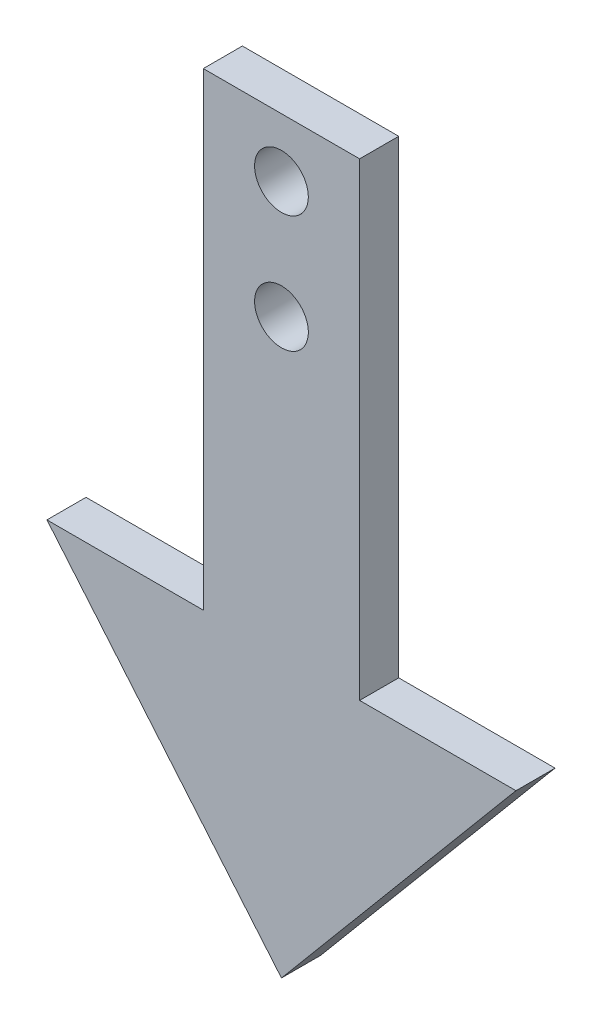
ISO-10303-21;
HEADER;
FILE_DESCRIPTION(('STEP AP214'),'2;1');
FILE_NAME('part.step','',(''),(''),'','','');
FILE_SCHEMA(('AUTOMOTIVE_DESIGN { 1 0 10303 214 1 1 1 1 }'));
ENDSEC;
DATA;
#1=APPLICATION_CONTEXT('core data for automotive mechanical design processes');
#2=APPLICATION_PROTOCOL_DEFINITION('international standard','automotive_design',2000,#1);
#3=PRODUCT_CONTEXT('',#1,'mechanical');
#4=PRODUCT('Part','Part','',(#3));
#5=PRODUCT_RELATED_PRODUCT_CATEGORY('part','',(#4));
#6=PRODUCT_DEFINITION_FORMATION('','',#4);
#7=PRODUCT_DEFINITION_CONTEXT('part definition',#1,'design');
#8=PRODUCT_DEFINITION('design','',#6,#7);
#9=PRODUCT_DEFINITION_SHAPE('','',#8);
#10=(LENGTH_UNIT() NAMED_UNIT(*) SI_UNIT(.MILLI.,.METRE.));
#11=(NAMED_UNIT(*) PLANE_ANGLE_UNIT() SI_UNIT($,.RADIAN.));
#12=(NAMED_UNIT(*) SI_UNIT($,.STERADIAN.) SOLID_ANGLE_UNIT());
#13=UNCERTAINTY_MEASURE_WITH_UNIT(LENGTH_MEASURE(1.E-05),#10,'distance_accuracy_value','');
#14=(GEOMETRIC_REPRESENTATION_CONTEXT(3) GLOBAL_UNCERTAINTY_ASSIGNED_CONTEXT((#13)) GLOBAL_UNIT_ASSIGNED_CONTEXT((#10,
#11,#12)) REPRESENTATION_CONTEXT('',''));
#15=CARTESIAN_POINT('',(0.,0.,0.));
#16=DIRECTION('',(0.,0.,1.));
#17=DIRECTION('',(1.,0.,0.));
#18=AXIS2_PLACEMENT_3D('',#15,#16,#17);
#19=CARTESIAN_POINT('',(6.35000000000002,-19.05,3.175));
#20=DIRECTION('',(0.,-1.,0.));
#21=DIRECTION('',(1.,0.,0.));
#22=AXIS2_PLACEMENT_3D('',#19,#20,#21);
#23=PLANE('',#22);
#24=DIRECTION('',(-1.,0.,0.));
#25=VECTOR('',#24,1.);
#26=CARTESIAN_POINT('',(6.35000000000002,-19.05,0.));
#27=LINE('',#26,#25);
#28=CARTESIAN_POINT('',(19.05,-19.05,0.));
#29=VERTEX_POINT('',#28);
#30=CARTESIAN_POINT('',(6.35000000000002,-19.05,0.));
#31=VERTEX_POINT('',#30);
#32=EDGE_CURVE('E125',#29,#31,#27,.T.);
#33=ORIENTED_EDGE('',*,*,#32,.T.);
#34=DIRECTION('',(0.,0.,-1.));
#35=VECTOR('',#34,1.);
#36=CARTESIAN_POINT('',(6.35000000000002,-19.05,3.175));
#37=LINE('',#36,#35);
#38=CARTESIAN_POINT('',(6.35000000000002,-19.05,3.175));
#39=VERTEX_POINT('',#38);
#40=EDGE_CURVE('E11',#39,#31,#37,.T.);
#41=ORIENTED_EDGE('',*,*,#40,.F.);
#42=DIRECTION('',(-1.,0.,0.));
#43=VECTOR('',#42,1.);
#44=CARTESIAN_POINT('',(6.35000000000002,-19.05,3.175));
#45=LINE('',#44,#43);
#46=CARTESIAN_POINT('',(19.05,-19.05,3.175));
#47=VERTEX_POINT('',#46);
#48=EDGE_CURVE('E138',#47,#39,#45,.T.);
#49=ORIENTED_EDGE('',*,*,#48,.F.);
#50=DIRECTION('',(0.,0.,-1.));
#51=VECTOR('',#50,1.);
#52=CARTESIAN_POINT('',(19.05,-19.05,3.175));
#53=LINE('',#52,#51);
#54=EDGE_CURVE('E121',#47,#29,#53,.T.);
#55=ORIENTED_EDGE('',*,*,#54,.T.);
#56=EDGE_LOOP('',(#33,#41,#49,#55));
#57=FACE_BOUND('',#56,.T.);
#58=ADVANCED_FACE('F35',(#57),#23,.F.);
#59=CARTESIAN_POINT('',(6.35,19.05,3.175));
#60=DIRECTION('',(-1.,0.,0.));
#61=DIRECTION('',(0.,-1.,0.));
#62=AXIS2_PLACEMENT_3D('',#59,#60,#61);
#63=PLANE('',#62);
#64=DIRECTION('',(0.,1.,0.));
#65=VECTOR('',#64,1.);
#66=CARTESIAN_POINT('',(6.35,19.05,0.));
#67=LINE('',#66,#65);
#68=CARTESIAN_POINT('',(6.35,19.05,0.));
#69=VERTEX_POINT('',#68);
#70=EDGE_CURVE('E128',#31,#69,#67,.T.);
#71=ORIENTED_EDGE('',*,*,#70,.T.);
#72=DIRECTION('',(0.,0.,-1.));
#73=VECTOR('',#72,1.);
#74=CARTESIAN_POINT('',(6.35,19.05,3.175));
#75=LINE('',#74,#73);
#76=CARTESIAN_POINT('',(6.35,19.05,3.175));
#77=VERTEX_POINT('',#76);
#78=EDGE_CURVE('E43',#77,#69,#75,.T.);
#79=ORIENTED_EDGE('',*,*,#78,.F.);
#80=DIRECTION('',(0.,1.,0.));
#81=VECTOR('',#80,1.);
#82=CARTESIAN_POINT('',(6.35,19.05,3.175));
#83=LINE('',#82,#81);
#84=EDGE_CURVE('E91',#39,#77,#83,.T.);
#85=ORIENTED_EDGE('',*,*,#84,.F.);
#86=ORIENTED_EDGE('',*,*,#40,.T.);
#87=EDGE_LOOP('',(#71,#79,#85,#86));
#88=FACE_BOUND('',#87,.T.);
#89=ADVANCED_FACE('F197',(#88),#63,.F.);
#90=CARTESIAN_POINT('',(-6.35,19.05,3.175));
#91=DIRECTION('',(0.,-1.,0.));
#92=DIRECTION('',(1.,0.,0.));
#93=AXIS2_PLACEMENT_3D('',#90,#91,#92);
#94=PLANE('',#93);
#95=DIRECTION('',(-1.,0.,0.));
#96=VECTOR('',#95,1.);
#97=CARTESIAN_POINT('',(-6.35,19.05,0.));
#98=LINE('',#97,#96);
#99=CARTESIAN_POINT('',(-6.35,19.05,0.));
#100=VERTEX_POINT('',#99);
#101=EDGE_CURVE('E131',#69,#100,#98,.T.);
#102=ORIENTED_EDGE('',*,*,#101,.T.);
#103=DIRECTION('',(0.,0.,-1.));
#104=VECTOR('',#103,1.);
#105=CARTESIAN_POINT('',(-6.35,19.05,3.175));
#106=LINE('',#105,#104);
#107=CARTESIAN_POINT('',(-6.35,19.05,3.175));
#108=VERTEX_POINT('',#107);
#109=EDGE_CURVE('E142',#108,#100,#106,.T.);
#110=ORIENTED_EDGE('',*,*,#109,.F.);
#111=DIRECTION('',(-1.,0.,0.));
#112=VECTOR('',#111,1.);
#113=CARTESIAN_POINT('',(-6.35,19.05,3.175));
#114=LINE('',#113,#112);
#115=EDGE_CURVE('E150',#77,#108,#114,.T.);
#116=ORIENTED_EDGE('',*,*,#115,.F.);
#117=ORIENTED_EDGE('',*,*,#78,.T.);
#118=EDGE_LOOP('',(#102,#110,#116,#117));
#119=FACE_BOUND('',#118,.T.);
#120=ADVANCED_FACE('F148',(#119),#94,.F.);
#121=CARTESIAN_POINT('',(-6.35,19.05,3.175));
#122=DIRECTION('',(1.,0.,0.));
#123=DIRECTION('',(0.,1.,0.));
#124=AXIS2_PLACEMENT_3D('',#121,#122,#123);
#125=PLANE('',#124);
#126=DIRECTION('',(0.,-1.,0.));
#127=VECTOR('',#126,1.);
#128=CARTESIAN_POINT('',(-6.35,19.05,0.));
#129=LINE('',#128,#127);
#130=CARTESIAN_POINT('',(-6.35000000000001,-19.05,0.));
#131=VERTEX_POINT('',#130);
#132=EDGE_CURVE('E133',#100,#131,#129,.T.);
#133=ORIENTED_EDGE('',*,*,#132,.T.);
#134=DIRECTION('',(0.,0.,-1.));
#135=VECTOR('',#134,1.);
#136=CARTESIAN_POINT('',(-6.35000000000001,-19.05,3.175));
#137=LINE('',#136,#135);
#138=CARTESIAN_POINT('',(-6.35000000000001,-19.05,3.175));
#139=VERTEX_POINT('',#138);
#140=EDGE_CURVE('E116',#139,#131,#137,.T.);
#141=ORIENTED_EDGE('',*,*,#140,.F.);
#142=DIRECTION('',(0.,-1.,0.));
#143=VECTOR('',#142,1.);
#144=CARTESIAN_POINT('',(-6.35,19.05,3.175));
#145=LINE('',#144,#143);
#146=EDGE_CURVE('E107',#108,#139,#145,.T.);
#147=ORIENTED_EDGE('',*,*,#146,.F.);
#148=ORIENTED_EDGE('',*,*,#109,.T.);
#149=EDGE_LOOP('',(#133,#141,#147,#148));
#150=FACE_BOUND('',#149,.T.);
#151=ADVANCED_FACE('F156',(#150),#125,.F.);
#152=CARTESIAN_POINT('',(-6.35000000000001,-19.05,3.175));
#153=DIRECTION('',(0.,-1.,0.));
#154=DIRECTION('',(1.,0.,0.));
#155=AXIS2_PLACEMENT_3D('',#152,#153,#154);
#156=PLANE('',#155);
#157=DIRECTION('',(-1.,0.,0.));
#158=VECTOR('',#157,1.);
#159=CARTESIAN_POINT('',(-6.35000000000001,-19.05,0.));
#160=LINE('',#159,#158);
#161=CARTESIAN_POINT('',(-19.05,-19.05,0.));
#162=VERTEX_POINT('',#161);
#163=EDGE_CURVE('E115',#131,#162,#160,.T.);
#164=ORIENTED_EDGE('',*,*,#163,.T.);
#165=DIRECTION('',(0.,0.,-1.));
#166=VECTOR('',#165,1.);
#167=CARTESIAN_POINT('',(-19.05,-19.05,3.175));
#168=LINE('',#167,#166);
#169=CARTESIAN_POINT('',(-19.05,-19.05,3.175));
#170=VERTEX_POINT('',#169);
#171=EDGE_CURVE('E112',#170,#162,#168,.T.);
#172=ORIENTED_EDGE('',*,*,#171,.F.);
#173=DIRECTION('',(-1.,0.,0.));
#174=VECTOR('',#173,1.);
#175=CARTESIAN_POINT('',(-6.35000000000001,-19.05,3.175));
#176=LINE('',#175,#174);
#177=EDGE_CURVE('E101',#139,#170,#176,.T.);
#178=ORIENTED_EDGE('',*,*,#177,.F.);
#179=ORIENTED_EDGE('',*,*,#140,.T.);
#180=EDGE_LOOP('',(#164,#172,#178,#179));
#181=FACE_BOUND('',#180,.T.);
#182=ADVANCED_FACE('F113',(#181),#156,.F.);
#183=CARTESIAN_POINT('',(-19.05,-19.05,3.175));
#184=DIRECTION('',(0.766044443118975,0.642787609686544,0.));
#185=DIRECTION('',(-0.642787609686544,0.766044443118975,0.));
#186=AXIS2_PLACEMENT_3D('',#183,#184,#185);
#187=PLANE('',#186);
#188=DIRECTION('',(0.642787609686543,-0.766044443118974,0.));
#189=VECTOR('',#188,1.);
#190=CARTESIAN_POINT('',(-19.05,-19.05,0.));
#191=LINE('',#190,#189);
#192=CARTESIAN_POINT('',(0.,-41.7529059389195,0.));
#193=VERTEX_POINT('',#192);
#194=EDGE_CURVE('E77',#162,#193,#191,.T.);
#195=ORIENTED_EDGE('',*,*,#194,.T.);
#196=DIRECTION('',(0.,0.,-1.));
#197=VECTOR('',#196,1.);
#198=CARTESIAN_POINT('',(0.,-41.7529059389195,3.175));
#199=LINE('',#198,#197);
#200=CARTESIAN_POINT('',(0.,-41.7529059389195,3.175));
#201=VERTEX_POINT('',#200);
#202=EDGE_CURVE('E117',#201,#193,#199,.T.);
#203=ORIENTED_EDGE('',*,*,#202,.F.);
#204=DIRECTION('',(0.642787609686543,-0.766044443118974,0.));
#205=VECTOR('',#204,1.);
#206=CARTESIAN_POINT('',(-19.05,-19.05,3.175));
#207=LINE('',#206,#205);
#208=EDGE_CURVE('E105',#170,#201,#207,.T.);
#209=ORIENTED_EDGE('',*,*,#208,.F.);
#210=ORIENTED_EDGE('',*,*,#171,.T.);
#211=EDGE_LOOP('',(#195,#203,#209,#210));
#212=FACE_BOUND('',#211,.T.);
#213=ADVANCED_FACE('F119',(#212),#187,.F.);
#214=CARTESIAN_POINT('',(0.,-41.7529059389195,3.175));
#215=DIRECTION('',(-0.766044443118975,0.642787609686543,0.));
#216=DIRECTION('',(-0.642787609686543,-0.766044443118975,0.));
#217=AXIS2_PLACEMENT_3D('',#214,#215,#216);
#218=PLANE('',#217);
#219=DIRECTION('',(0.642787609686543,0.766044443118975,0.));
#220=VECTOR('',#219,1.);
#221=CARTESIAN_POINT('',(0.,-41.7529059389195,0.));
#222=LINE('',#221,#220);
#223=EDGE_CURVE('E83',#193,#29,#222,.T.);
#224=ORIENTED_EDGE('',*,*,#223,.T.);
#225=ORIENTED_EDGE('',*,*,#54,.F.);
#226=DIRECTION('',(0.642787609686543,0.766044443118975,0.));
#227=VECTOR('',#226,1.);
#228=CARTESIAN_POINT('',(0.,-41.7529059389195,3.175));
#229=LINE('',#228,#227);
#230=EDGE_CURVE('E51',#201,#47,#229,.T.);
#231=ORIENTED_EDGE('',*,*,#230,.F.);
#232=ORIENTED_EDGE('',*,*,#202,.T.);
#233=EDGE_LOOP('',(#224,#225,#231,#232));
#234=FACE_BOUND('',#233,.T.);
#235=ADVANCED_FACE('F184',(#234),#218,.F.);
#236=CARTESIAN_POINT('',(0.,0.,3.175));
#237=DIRECTION('',(0.,0.,-1.));
#238=DIRECTION('',(-1.,0.,0.));
#239=AXIS2_PLACEMENT_3D('',#236,#237,#238);
#240=PLANE('',#239);
#241=CARTESIAN_POINT('',(0.,14.2875,3.175));
#242=DIRECTION('',(0.,0.,1.));
#243=DIRECTION('',(1.,0.,0.));
#244=AXIS2_PLACEMENT_3D('',#241,#242,#243);
#245=CIRCLE('',#244,2.1828125);
#246=CARTESIAN_POINT('',(2.1828125,14.2875,3.175));
#247=VERTEX_POINT('',#246);
#248=EDGE_CURVE('E167',#247,#247,#245,.T.);
#249=ORIENTED_EDGE('',*,*,#248,.F.);
#250=EDGE_LOOP('',(#249));
#251=FACE_BOUND('',#250,.T.);
#252=CARTESIAN_POINT('',(0.,4.76249999999998,3.175));
#253=DIRECTION('',(0.,0.,1.));
#254=DIRECTION('',(-1.,0.,0.));
#255=AXIS2_PLACEMENT_3D('',#252,#253,#254);
#256=CIRCLE('',#255,2.1828125);
#257=CARTESIAN_POINT('',(-2.1828125,4.76249999999998,3.175));
#258=VERTEX_POINT('',#257);
#259=EDGE_CURVE('E161',#258,#258,#256,.T.);
#260=ORIENTED_EDGE('',*,*,#259,.F.);
#261=EDGE_LOOP('',(#260));
#262=FACE_BOUND('',#261,.T.);
#263=ORIENTED_EDGE('',*,*,#48,.T.);
#264=ORIENTED_EDGE('',*,*,#84,.T.);
#265=ORIENTED_EDGE('',*,*,#115,.T.);
#266=ORIENTED_EDGE('',*,*,#146,.T.);
#267=ORIENTED_EDGE('',*,*,#177,.T.);
#268=ORIENTED_EDGE('',*,*,#208,.T.);
#269=ORIENTED_EDGE('',*,*,#230,.T.);
#270=EDGE_LOOP('',(#263,#264,#265,#266,#267,#268,#269));
#271=FACE_BOUND('',#270,.T.);
#272=ADVANCED_FACE('F103',(#251,#262,#271),#240,.F.);
#273=CARTESIAN_POINT('',(0.,0.,0.));
#274=DIRECTION('',(0.,0.,-1.));
#275=DIRECTION('',(-1.,0.,0.));
#276=AXIS2_PLACEMENT_3D('',#273,#274,#275);
#277=PLANE('',#276);
#278=CARTESIAN_POINT('',(0.,14.2875,0.));
#279=DIRECTION('',(0.,0.,1.));
#280=DIRECTION('',(1.,0.,0.));
#281=AXIS2_PLACEMENT_3D('',#278,#279,#280);
#282=CIRCLE('',#281,2.1828125);
#283=CARTESIAN_POINT('',(2.1828125,14.2875,0.));
#284=VERTEX_POINT('',#283);
#285=EDGE_CURVE('E164',#284,#284,#282,.T.);
#286=ORIENTED_EDGE('',*,*,#285,.T.);
#287=EDGE_LOOP('',(#286));
#288=FACE_BOUND('',#287,.T.);
#289=CARTESIAN_POINT('',(0.,4.76249999999998,0.));
#290=DIRECTION('',(0.,0.,1.));
#291=DIRECTION('',(-1.,0.,0.));
#292=AXIS2_PLACEMENT_3D('',#289,#290,#291);
#293=CIRCLE('',#292,2.1828125);
#294=CARTESIAN_POINT('',(-2.1828125,4.76249999999998,0.));
#295=VERTEX_POINT('',#294);
#296=EDGE_CURVE('E129',#295,#295,#293,.T.);
#297=ORIENTED_EDGE('',*,*,#296,.T.);
#298=EDGE_LOOP('',(#297));
#299=FACE_BOUND('',#298,.T.);
#300=ORIENTED_EDGE('',*,*,#32,.F.);
#301=ORIENTED_EDGE('',*,*,#223,.F.);
#302=ORIENTED_EDGE('',*,*,#194,.F.);
#303=ORIENTED_EDGE('',*,*,#163,.F.);
#304=ORIENTED_EDGE('',*,*,#132,.F.);
#305=ORIENTED_EDGE('',*,*,#101,.F.);
#306=ORIENTED_EDGE('',*,*,#70,.F.);
#307=EDGE_LOOP('',(#300,#301,#302,#303,#304,#305,#306));
#308=FACE_BOUND('',#307,.T.);
#309=ADVANCED_FACE('F154',(#288,#299,#308),#277,.T.);
#310=CARTESIAN_POINT('',(0.,4.76249999999998,0.));
#311=DIRECTION('',(0.,0.,1.));
#312=DIRECTION('',(1.,0.,0.));
#313=AXIS2_PLACEMENT_3D('',#310,#311,#312);
#314=CYLINDRICAL_SURFACE('',#313,2.1828125);
#315=ORIENTED_EDGE('',*,*,#296,.F.);
#316=EDGE_LOOP('',(#315));
#317=FACE_BOUND('',#316,.T.);
#318=ORIENTED_EDGE('',*,*,#259,.T.);
#319=EDGE_LOOP('',(#318));
#320=FACE_BOUND('',#319,.T.);
#321=ADVANCED_FACE('F178',(#317,#320),#314,.F.);
#322=CARTESIAN_POINT('',(0.,14.2875,0.));
#323=DIRECTION('',(0.,0.,1.));
#324=DIRECTION('',(1.,0.,0.));
#325=AXIS2_PLACEMENT_3D('',#322,#323,#324);
#326=CYLINDRICAL_SURFACE('',#325,2.1828125);
#327=ORIENTED_EDGE('',*,*,#285,.F.);
#328=EDGE_LOOP('',(#327));
#329=FACE_BOUND('',#328,.T.);
#330=ORIENTED_EDGE('',*,*,#248,.T.);
#331=EDGE_LOOP('',(#330));
#332=FACE_BOUND('',#331,.T.);
#333=ADVANCED_FACE('F175',(#329,#332),#326,.F.);
#334=CLOSED_SHELL('',(#58,#89,#120,#151,#182,#213,#235,#272,#309,#321,#333));
#335=MANIFOLD_SOLID_BREP('B2',#334);
#336=ADVANCED_BREP_SHAPE_REPRESENTATION('',(#18,#335),#14);
#337=SHAPE_DEFINITION_REPRESENTATION(#9,#336);
ENDSEC;
END-ISO-10303-21;
